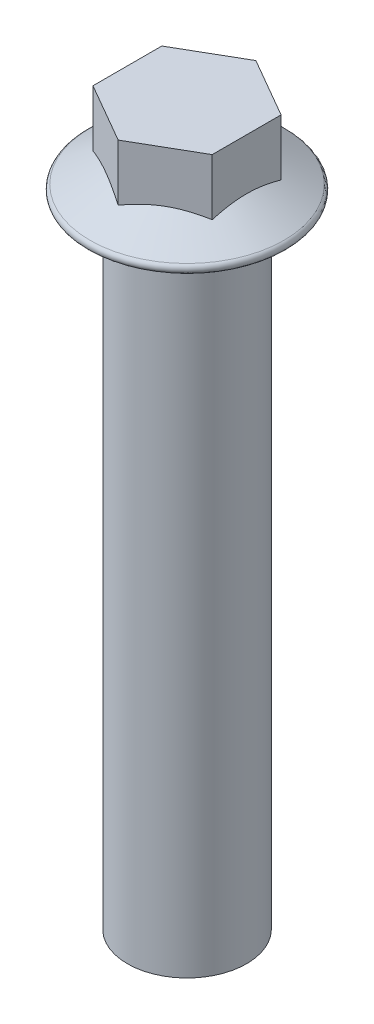
ISO-10303-21;
HEADER;
FILE_DESCRIPTION(('STEP AP214'),'2;1');
FILE_NAME('part.step','',(''),(''),'','','');
FILE_SCHEMA(('AUTOMOTIVE_DESIGN { 1 0 10303 214 1 1 1 1 }'));
ENDSEC;
DATA;
#1=APPLICATION_CONTEXT('core data for automotive mechanical design processes');
#2=APPLICATION_PROTOCOL_DEFINITION('international standard','automotive_design',2000,#1);
#3=PRODUCT_CONTEXT('',#1,'mechanical');
#4=PRODUCT('Part','Part','',(#3));
#5=PRODUCT_RELATED_PRODUCT_CATEGORY('part','',(#4));
#6=PRODUCT_DEFINITION_FORMATION('','',#4);
#7=PRODUCT_DEFINITION_CONTEXT('part definition',#1,'design');
#8=PRODUCT_DEFINITION('design','',#6,#7);
#9=PRODUCT_DEFINITION_SHAPE('','',#8);
#10=(LENGTH_UNIT() NAMED_UNIT(*) SI_UNIT(.MILLI.,.METRE.));
#11=(NAMED_UNIT(*) PLANE_ANGLE_UNIT() SI_UNIT($,.RADIAN.));
#12=(NAMED_UNIT(*) SI_UNIT($,.STERADIAN.) SOLID_ANGLE_UNIT());
#13=UNCERTAINTY_MEASURE_WITH_UNIT(LENGTH_MEASURE(1.E-05),#10,'distance_accuracy_value','');
#14=(GEOMETRIC_REPRESENTATION_CONTEXT(3) GLOBAL_UNCERTAINTY_ASSIGNED_CONTEXT((#13)) GLOBAL_UNIT_ASSIGNED_CONTEXT((#10,
#11,#12)) REPRESENTATION_CONTEXT('',''));
#15=CARTESIAN_POINT('',(0.,0.,0.));
#16=DIRECTION('',(0.,0.,1.));
#17=DIRECTION('',(1.,0.,0.));
#18=AXIS2_PLACEMENT_3D('',#15,#16,#17);
#19=CARTESIAN_POINT('',(0.,101.6,0.));
#20=DIRECTION('',(0.,-1.,0.));
#21=DIRECTION('',(0.,0.,-1.));
#22=AXIS2_PLACEMENT_3D('',#19,#20,#21);
#23=CYLINDRICAL_SURFACE('',#22,9.525);
#24=CARTESIAN_POINT('',(0.,101.6,0.));
#25=DIRECTION('',(0.,1.,0.));
#26=DIRECTION('',(0.,0.,1.));
#27=AXIS2_PLACEMENT_3D('',#24,#25,#26);
#28=CIRCLE('',#27,9.525);
#29=CARTESIAN_POINT('',(0.,101.6,9.525));
#30=VERTEX_POINT('',#29);
#31=EDGE_CURVE('E55',#30,#30,#28,.T.);
#32=ORIENTED_EDGE('',*,*,#31,.F.);
#33=EDGE_LOOP('',(#32));
#34=FACE_BOUND('',#33,.T.);
#35=CARTESIAN_POINT('',(0.,0.,0.));
#36=DIRECTION('',(0.,1.,0.));
#37=DIRECTION('',(0.,0.,1.));
#38=AXIS2_PLACEMENT_3D('',#35,#36,#37);
#39=CIRCLE('',#38,9.525);
#40=CARTESIAN_POINT('',(0.,0.,9.525));
#41=VERTEX_POINT('',#40);
#42=EDGE_CURVE('E196',#41,#41,#39,.T.);
#43=ORIENTED_EDGE('',*,*,#42,.T.);
#44=EDGE_LOOP('',(#43));
#45=FACE_BOUND('',#44,.T.);
#46=ADVANCED_FACE('F42',(#34,#45),#23,.T.);
#47=CARTESIAN_POINT('',(0.,0.,0.));
#48=DIRECTION('',(0.,1.,0.));
#49=DIRECTION('',(0.,0.,1.));
#50=AXIS2_PLACEMENT_3D('',#47,#48,#49);
#51=PLANE('',#50);
#52=CARTESIAN_POINT('',(0.,0.,0.));
#53=DIRECTION('',(0.,-1.,0.));
#54=DIRECTION('',(0.,0.,-1.));
#55=AXIS2_PLACEMENT_3D('',#52,#53,#54);
#56=CIRCLE('',#55,5.35812999999999);
#57=CARTESIAN_POINT('',(0.,0.,-5.35812999999999));
#58=VERTEX_POINT('',#57);
#59=EDGE_CURVE('E115',#58,#58,#56,.T.);
#60=ORIENTED_EDGE('',*,*,#59,.F.);
#61=EDGE_LOOP('',(#60));
#62=FACE_BOUND('',#61,.T.);
#63=ORIENTED_EDGE('',*,*,#42,.F.);
#64=EDGE_LOOP('',(#63));
#65=FACE_BOUND('',#64,.T.);
#66=ADVANCED_FACE('F182',(#62,#65),#51,.F.);
#67=CARTESIAN_POINT('',(0.,101.6,0.));
#68=DIRECTION('',(0.,-1.,0.));
#69=DIRECTION('',(0.,0.,-1.));
#70=AXIS2_PLACEMENT_3D('',#67,#68,#69);
#71=PLANE('',#70);
#72=ORIENTED_EDGE('',*,*,#31,.T.);
#73=EDGE_LOOP('',(#72));
#74=FACE_BOUND('',#73,.T.);
#75=CARTESIAN_POINT('',(0.,101.6,0.));
#76=DIRECTION('',(0.,-1.,0.));
#77=DIRECTION('',(1.,0.,0.));
#78=AXIS2_PLACEMENT_3D('',#75,#76,#77);
#79=CIRCLE('',#78,15.1082963753831);
#80=CARTESIAN_POINT('',(15.1082963753831,101.6,0.));
#81=VERTEX_POINT('',#80);
#82=EDGE_CURVE('E118',#81,#81,#79,.T.);
#83=ORIENTED_EDGE('',*,*,#82,.T.);
#84=EDGE_LOOP('',(#83));
#85=FACE_BOUND('',#84,.T.);
#86=ADVANCED_FACE('F147',(#74,#85),#71,.T.);
#87=CARTESIAN_POINT('',(0.,112.033072531662,0.));
#88=DIRECTION('',(0.,-1.,0.));
#89=DIRECTION('',(1.,0.,0.));
#90=AXIS2_PLACEMENT_3D('',#87,#88,#89);
#91=CONICAL_SURFACE('',#90,0.,1.0471975511966);
#92=CARTESIAN_POINT('',(0.,103.081157664254,0.));
#93=DIRECTION('',(0.,-1.,0.));
#94=DIRECTION('',(1.,0.,0.));
#95=AXIS2_PLACEMENT_3D('',#92,#93,#94);
#96=CIRCLE('',#95,15.5051713753831);
#97=CARTESIAN_POINT('',(15.5051713753831,103.081157664254,0.));
#98=VERTEX_POINT('',#97);
#99=EDGE_CURVE('E114',#98,#98,#96,.T.);
#100=ORIENTED_EDGE('',*,*,#99,.F.);
#101=EDGE_LOOP('',(#100));
#102=FACE_BOUND('',#101,.T.);
#103=CARTESIAN_POINT('',(-9.525,102.019915785762,-14.4935951045248));
#104=CARTESIAN_POINT('',(-9.525,102.119771856216,-14.2866287942035));
#105=CARTESIAN_POINT('',(-9.525,102.219108198637,-14.0794118473676));
#106=CARTESIAN_POINT('',(-9.525,102.416623063622,-13.6644242508099));
#107=CARTESIAN_POINT('',(-9.525,102.514801573584,-13.4566535950909));
#108=CARTESIAN_POINT('',(-9.525,102.807450620474,-12.832372924565));
#109=CARTESIAN_POINT('',(-9.525,103.000002802117,-12.4149600765863));
#110=CARTESIAN_POINT('',(-9.525,103.379868067489,-11.5748374861354));
#111=CARTESIAN_POINT('',(-9.525,103.567144365118,-11.152111068246));
#112=CARTESIAN_POINT('',(-9.525,103.933648504368,-10.3031954996916));
#113=CARTESIAN_POINT('',(-9.525,104.112876747702,-9.87700652311442));
#114=CARTESIAN_POINT('',(-9.525,104.466131529965,-9.0082204205499));
#115=CARTESIAN_POINT('',(-9.525,104.639862830153,-8.56550255921177));
#116=CARTESIAN_POINT('',(-9.525,104.97349080534,-7.67478808422141));
#117=CARTESIAN_POINT('',(-9.525,105.1333858919,-7.22679087117319));
#118=CARTESIAN_POINT('',(-9.525,105.434940409718,-6.325730472178));
#119=CARTESIAN_POINT('',(-9.525,105.57663922047,-5.87268061370604));
#120=CARTESIAN_POINT('',(-9.525,105.83707715476,-4.96011012380103));
#121=CARTESIAN_POINT('',(-9.525,105.955823802743,-4.50059166616066));
#122=CARTESIAN_POINT('',(-9.525,106.163902154091,-3.57705013004533));
#123=CARTESIAN_POINT('',(-9.525,106.253370812037,-3.11305878907075));
#124=CARTESIAN_POINT('',(-9.525,106.361567289479,-2.41307999933419));
#125=CARTESIAN_POINT('',(-9.525,106.39329983853,-2.17906985155997));
#126=CARTESIAN_POINT('',(-9.525,106.447468674522,-1.70998351601931));
#127=CARTESIAN_POINT('',(-9.525,106.46990584902,-1.47490743220029));
#128=CARTESIAN_POINT('',(-9.525,106.504769364559,-1.00695046448251));
#129=CARTESIAN_POINT('',(-9.525,106.517316700352,-0.774078624980496));
#130=CARTESIAN_POINT('',(-9.525,106.532576363659,-0.308013948404421));
#131=CARTESIAN_POINT('',(-9.525,106.535288846115,-0.074821116445283));
#132=CARTESIAN_POINT('',(-9.525,106.530814231536,0.39147717532233));
#133=CARTESIAN_POINT('',(-9.525,106.523626831945,0.624582632242708));
#134=CARTESIAN_POINT('',(-9.525,106.499521967316,1.09029330137625));
#135=CARTESIAN_POINT('',(-9.525,106.482603996255,1.32289848694218));
#136=CARTESIAN_POINT('',(-9.525,106.429810173597,1.89034327030716));
#137=CARTESIAN_POINT('',(-9.525,106.388852071915,2.22471764460386));
#138=CARTESIAN_POINT('',(-9.525,106.289126004335,2.89080207642086));
#139=CARTESIAN_POINT('',(-9.525,106.230355391462,3.22251173043302));
#140=CARTESIAN_POINT('',(-9.525,106.097095138146,3.88300360579086));
#141=CARTESIAN_POINT('',(-9.525,106.022592991278,4.21178327979651));
#142=CARTESIAN_POINT('',(-9.525,105.860121743613,4.86596003569804));
#143=CARTESIAN_POINT('',(-9.525,105.772152907011,5.1913571838202));
#144=CARTESIAN_POINT('',(-9.525,105.582680062788,5.84630145200541));
#145=CARTESIAN_POINT('',(-9.525,105.480910771813,6.17577130370605));
#146=CARTESIAN_POINT('',(-9.525,105.267444141501,6.83146143201844));
#147=CARTESIAN_POINT('',(-9.525,105.155746728328,7.15768168444233));
#148=CARTESIAN_POINT('',(-9.525,104.92414652241,7.80705083219056));
#149=CARTESIAN_POINT('',(-9.525,104.804246693786,8.13020078945637));
#150=CARTESIAN_POINT('',(-9.525,104.557594809195,8.77385581231393));
#151=CARTESIAN_POINT('',(-9.525,104.430842897697,9.09436093350572));
#152=CARTESIAN_POINT('',(-9.525,104.080660608296,9.95725080054012));
#153=CARTESIAN_POINT('',(-9.525,103.851828306228,10.4974417923221));
#154=CARTESIAN_POINT('',(-9.525,103.381955956943,11.572506333547));
#155=CARTESIAN_POINT('',(-9.525,103.140914707584,12.1073793531333));
#156=CARTESIAN_POINT('',(-9.525,102.649541489012,13.1730460909547));
#157=CARTESIAN_POINT('',(-9.525,102.399206417772,13.7038383744836));
#158=CARTESIAN_POINT('',(-9.525,101.89147779634,14.7620017747838));
#159=CARTESIAN_POINT('',(-9.525,101.634084503054,15.2893730152125));
#160=CARTESIAN_POINT('',(-9.525,101.113407918561,16.3421358228847));
#161=CARTESIAN_POINT('',(-9.525,100.850116711136,16.8675234673204));
#162=CARTESIAN_POINT('',(-9.525,100.319147326255,17.9160787346795));
#163=CARTESIAN_POINT('',(-9.525,100.051469115917,18.4392463409261));
#164=CARTESIAN_POINT('',(-9.525,99.5126402140084,19.4836592078866));
#165=CARTESIAN_POINT('',(-9.525,99.2414902091513,20.0049048232768));
#166=CARTESIAN_POINT('',(-9.525,98.6963154360731,21.0458912986243));
#167=CARTESIAN_POINT('',(-9.525,98.4222906579405,21.5656321533859));
#168=CARTESIAN_POINT('',(-9.525,97.6539500556607,23.0149547643607));
#169=CARTESIAN_POINT('',(-9.525,97.1570292024486,23.9431552396874));
#170=CARTESIAN_POINT('',(-9.525,96.1576888701562,25.7966506089527));
#171=CARTESIAN_POINT('',(-9.525,95.6552690917121,26.7219453411368));
#172=CARTESIAN_POINT('',(-9.525,94.6478166614444,28.5675656251149));
#173=CARTESIAN_POINT('',(-9.525,94.1427961034965,29.4878977824141));
#174=CARTESIAN_POINT('',(-9.525,93.3829354282915,30.86706955088));
#175=CARTESIAN_POINT('',(-9.525,93.1292689982839,31.3265566087974));
#176=CARTESIAN_POINT('',(-9.525,92.6212404741823,32.2451453677475));
#177=CARTESIAN_POINT('',(-9.525,92.3668783808376,32.7042470691947));
#178=CARTESIAN_POINT('',(-9.525,92.1122115077655,33.1631796847088));
#179=B_SPLINE_CURVE_WITH_KNOTS('',3,(#103,#104,#105,#106,#107,#108,#109,#110,#111,#112,#113,
#114,#115,#116,#117,#118,#119,#120,#121,#122,#123,#124,#125,#126,#127,#128,#129,#130,#131,#132,
#133,#134,#135,#136,#137,#138,#139,#140,#141,#142,#143,#144,#145,#146,#147,#148,#149,#150,#151,
#152,#153,#154,#155,#156,#157,#158,#159,#160,#161,#162,#163,#164,#165,#166,#167,#168,#169,#170,
#171,#172,#173,#174,#175,#176,#177,#178),.UNSPECIFIED.,.F.,.F.,(4,2,2,2,2,2,2,2,2,2,2,2,2,2,2,2,
2,2,2,2,2,2,2,2,2,2,2,2,2,2,2,2,2,2,2,2,2,4),(0.,0.689387227026352,1.37878195126197,
2.75779091431507,4.14478370852079,5.53170719495302,6.95828488683363,8.38502613760612,
9.80862571387312,11.2317577945604,12.6481343840629,13.35643426059,14.0646664904178,
14.7640933899208,15.4635092703791,16.1629465265214,16.8624201589925,17.8724764887064,
18.8826829884563,19.8936956372978,20.9046884541563,21.938988465498,22.9732961697387,
24.0072320588138,25.0411461567132,26.8008998808382,28.5608272156893,30.3213473434833,
32.0818034766396,33.8447838485144,35.6077774404,37.3704275437124,39.1330837261958,
42.2915953781862,45.4502798447675,48.5996384963749,50.1742094717577,51.7487787514473),.UNSPECIFIED.);
#180=CARTESIAN_POINT('',(-9.525,105.683072531663,5.49926131403119));
#181=VERTEX_POINT('',#180);
#182=CARTESIAN_POINT('',(-9.525,105.683072531663,-5.49926131403119));
#183=VERTEX_POINT('',#182);
#184=EDGE_CURVE('E69',#181,#183,#179,.F.);
#185=ORIENTED_EDGE('',*,*,#184,.T.);
#186=CARTESIAN_POINT('',(-9.5252,105.683005863946,-5.49914584397735));
#187=CARTESIAN_POINT('',(-9.31581967864219,105.752788016384,-5.62003162887629));
#188=CARTESIAN_POINT('',(-9.10565867807716,105.819402983673,-5.74136813912567));
#189=CARTESIAN_POINT('',(-8.68365134098093,105.945419747841,-5.98501418879818));
#190=CARTESIAN_POINT('',(-8.47180447441637,106.004819172322,-6.10732403423621));
#191=CARTESIAN_POINT('',(-7.83285037479193,106.171044612924,-6.47622435565419));
#192=CARTESIAN_POINT('',(-7.40322078278332,106.265592887713,-6.72427111625219));
#193=CARTESIAN_POINT('',(-6.76029976573862,106.376459588786,-7.09546173851062));
#194=CARTESIAN_POINT('',(-6.54892911393193,106.408041351482,-7.21749664123));
#195=CARTESIAN_POINT('',(-6.12520917517603,106.461001964502,-7.46213146193172));
#196=CARTESIAN_POINT('',(-5.91285986947048,106.48238061845,-7.58473139074305));
#197=CARTESIAN_POINT('',(-5.48780704353704,106.514387240959,-7.83013575421554));
#198=CARTESIAN_POINT('',(-5.27510424653561,106.525027985046,-7.9529397713217));
#199=CARTESIAN_POINT('',(-4.84950217933072,106.53533268268,-8.19866123939011));
#200=CARTESIAN_POINT('',(-4.63660291540071,106.534996975367,-8.32157868673037));
#201=CARTESIAN_POINT('',(-4.23858252685178,106.5241123774,-8.55137586520205));
#202=CARTESIAN_POINT('',(-4.0534333100133,106.514891273124,-8.658271815384));
#203=CARTESIAN_POINT('',(-3.68356790086971,106.48832641662,-8.87181370891698));
#204=CARTESIAN_POINT('',(-3.49885174012527,106.470982089806,-8.97845963404645));
#205=CARTESIAN_POINT('',(-2.94541899032713,106.407174339606,-9.29798418112076));
#206=CARTESIAN_POINT('',(-2.57768201658395,106.34894409616,-9.51029722190237));
#207=CARTESIAN_POINT('',(-1.83830726497711,106.203367925661,-9.93717543377459));
#208=CARTESIAN_POINT('',(-1.46676384734824,106.115404921285,-10.1516861259583));
#209=CARTESIAN_POINT('',(-0.729217612400581,105.915765420275,-10.5775086432451));
#210=CARTESIAN_POINT('',(-0.363205350578883,105.804135812171,-10.7888259211345));
#211=CARTESIAN_POINT('',(0.000200000000001881,105.683005863946,-10.9986380981162));
#212=B_SPLINE_CURVE_WITH_KNOTS('',3,(#186,#187,#188,#189,#190,#191,#192,#193,#194,#195,#196,
#197,#198,#199,#200,#201,#202,#203,#204,#205,#206,#207,#208,#209,#210,#211),.UNSPECIFIED.,.F.,
.F.,(4,2,2,2,2,2,2,2,2,2,2,2,4),(0.,0.754861746958001,1.50997101692212,3.02340406075151,
3.76154608748042,4.49970232035707,5.23697928598072,5.97423347202913,6.61604550518408,
7.25790294292824,8.54252993638602,9.85564695316764,11.1661863217647),.UNSPECIFIED.);
#213=CARTESIAN_POINT('',(0.,105.683072531663,-10.9985226280624));
#214=VERTEX_POINT('',#213);
#215=EDGE_CURVE('E62',#183,#214,#212,.T.);
#216=ORIENTED_EDGE('',*,*,#215,.T.);
#217=CARTESIAN_POINT('',(-0.000199999999998449,105.683005863946,-10.9986380981162));
#218=CARTESIAN_POINT('',(0.209180321357819,105.752788016384,-10.8777523132173));
#219=CARTESIAN_POINT('',(0.419341321922849,105.819402983673,-10.7564158029679));
#220=CARTESIAN_POINT('',(0.841348659019078,105.945419747841,-10.5127697532954));
#221=CARTESIAN_POINT('',(1.05319552558363,106.004819172322,-10.3904599078573));
#222=CARTESIAN_POINT('',(1.69214962520808,106.171044612924,-10.0215595864394));
#223=CARTESIAN_POINT('',(2.12177921721668,106.265592887713,-9.77351282584137));
#224=CARTESIAN_POINT('',(2.76470023426138,106.376459588786,-9.40232220358294));
#225=CARTESIAN_POINT('',(2.97607088606807,106.408041351482,-9.28028730086356));
#226=CARTESIAN_POINT('',(3.39979082482397,106.461001964502,-9.03565248016183));
#227=CARTESIAN_POINT('',(3.61214013052952,106.48238061845,-8.91305255135051));
#228=CARTESIAN_POINT('',(4.03719295646296,106.514387240959,-8.66764818787802));
#229=CARTESIAN_POINT('',(4.24989575346439,106.525027985046,-8.54484417077186));
#230=CARTESIAN_POINT('',(4.67549782066928,106.53533268268,-8.29912270270345));
#231=CARTESIAN_POINT('',(4.88839708459929,106.534996975367,-8.17620525536319));
#232=CARTESIAN_POINT('',(5.28641747314821,106.5241123774,-7.94640807689151));
#233=CARTESIAN_POINT('',(5.4715666899867,106.514891273124,-7.83951212670956));
#234=CARTESIAN_POINT('',(5.84143209913029,106.48832641662,-7.62597023317658));
#235=CARTESIAN_POINT('',(6.02614825987472,106.470982089806,-7.51932430804711));
#236=CARTESIAN_POINT('',(6.57958100967286,106.407174339606,-7.19979976097279));
#237=CARTESIAN_POINT('',(6.94731798341604,106.34894409616,-6.98748672019119));
#238=CARTESIAN_POINT('',(7.68669273502289,106.203367925661,-6.56060850831896));
#239=CARTESIAN_POINT('',(8.05823615265176,106.115404921285,-6.3460978161353));
#240=CARTESIAN_POINT('',(8.79578238759942,105.915765420275,-5.92027529884848));
#241=CARTESIAN_POINT('',(9.16179464942112,105.804135812171,-5.70895802095902));
#242=CARTESIAN_POINT('',(9.5252,105.683005863946,-5.49914584397735));
#243=B_SPLINE_CURVE_WITH_KNOTS('',3,(#217,#218,#219,#220,#221,#222,#223,#224,#225,#226,#227,
#228,#229,#230,#231,#232,#233,#234,#235,#236,#237,#238,#239,#240,#241,#242),.UNSPECIFIED.,.F.,
.F.,(4,2,2,2,2,2,2,2,2,2,2,2,4),(0.,0.754861746958,1.50997101692211,3.0234040607515,
3.76154608748042,4.49970232035706,5.23697928598071,5.97423347202912,6.61604550518407,
7.25790294292822,8.54252993638601,9.85564695316763,11.1661863217647),.UNSPECIFIED.);
#244=CARTESIAN_POINT('',(9.525,105.683072531663,-5.49926131403119));
#245=VERTEX_POINT('',#244);
#246=EDGE_CURVE('E11',#214,#245,#243,.T.);
#247=ORIENTED_EDGE('',*,*,#246,.T.);
#248=CARTESIAN_POINT('',(9.525,102.019915785762,-14.4935951045248));
#249=CARTESIAN_POINT('',(9.525,102.119771856216,-14.2866287942035));
#250=CARTESIAN_POINT('',(9.525,102.219108198637,-14.0794118473676));
#251=CARTESIAN_POINT('',(9.525,102.416623063622,-13.6644242508099));
#252=CARTESIAN_POINT('',(9.525,102.514801573584,-13.4566535950909));
#253=CARTESIAN_POINT('',(9.525,102.807450620474,-12.832372924565));
#254=CARTESIAN_POINT('',(9.525,103.000002802117,-12.4149600765863));
#255=CARTESIAN_POINT('',(9.525,103.379868067489,-11.5748374861354));
#256=CARTESIAN_POINT('',(9.525,103.567144365118,-11.152111068246));
#257=CARTESIAN_POINT('',(9.525,103.933648504368,-10.3031954996916));
#258=CARTESIAN_POINT('',(9.525,104.112876747702,-9.87700652311441));
#259=CARTESIAN_POINT('',(9.525,104.466131529965,-9.0082204205499));
#260=CARTESIAN_POINT('',(9.525,104.639862830153,-8.56550255921177));
#261=CARTESIAN_POINT('',(9.525,104.97349080534,-7.6747880842214));
#262=CARTESIAN_POINT('',(9.525,105.1333858919,-7.22679087117319));
#263=CARTESIAN_POINT('',(9.525,105.434940409718,-6.325730472178));
#264=CARTESIAN_POINT('',(9.525,105.57663922047,-5.87268061370604));
#265=CARTESIAN_POINT('',(9.525,105.83707715476,-4.96011012380103));
#266=CARTESIAN_POINT('',(9.525,105.955823802743,-4.50059166616066));
#267=CARTESIAN_POINT('',(9.525,106.163902154091,-3.57705013004532));
#268=CARTESIAN_POINT('',(9.525,106.253370812037,-3.11305878907074));
#269=CARTESIAN_POINT('',(9.525,106.361567289479,-2.41307999933419));
#270=CARTESIAN_POINT('',(9.525,106.39329983853,-2.17906985155997));
#271=CARTESIAN_POINT('',(9.525,106.447468674522,-1.70998351601931));
#272=CARTESIAN_POINT('',(9.525,106.46990584902,-1.47490743220029));
#273=CARTESIAN_POINT('',(9.525,106.504769364559,-1.00695046448251));
#274=CARTESIAN_POINT('',(9.525,106.517316700352,-0.774078624980493));
#275=CARTESIAN_POINT('',(9.525,106.532576363659,-0.308013948404418));
#276=CARTESIAN_POINT('',(9.525,106.535288846115,-0.0748211164452796));
#277=CARTESIAN_POINT('',(9.525,106.530814231536,0.391477175322334));
#278=CARTESIAN_POINT('',(9.525,106.523626831945,0.624582632242711));
#279=CARTESIAN_POINT('',(9.525,106.499521967316,1.09029330137625));
#280=CARTESIAN_POINT('',(9.525,106.482603996255,1.32289848694219));
#281=CARTESIAN_POINT('',(9.525,106.429810173597,1.89034327030716));
#282=CARTESIAN_POINT('',(9.525,106.388852071915,2.22471764460386));
#283=CARTESIAN_POINT('',(9.525,106.289126004335,2.89080207642086));
#284=CARTESIAN_POINT('',(9.525,106.230355391462,3.22251173043302));
#285=CARTESIAN_POINT('',(9.525,106.097095138146,3.88300360579086));
#286=CARTESIAN_POINT('',(9.525,106.022592991278,4.21178327979651));
#287=CARTESIAN_POINT('',(9.525,105.860121743613,4.86596003569804));
#288=CARTESIAN_POINT('',(9.525,105.772152907011,5.19135718382019));
#289=CARTESIAN_POINT('',(9.525,105.582680062788,5.84630145200541));
#290=CARTESIAN_POINT('',(9.525,105.480910771813,6.17577130370606));
#291=CARTESIAN_POINT('',(9.525,105.267444141501,6.83146143201845));
#292=CARTESIAN_POINT('',(9.525,105.155746728328,7.15768168444233));
#293=CARTESIAN_POINT('',(9.525,104.92414652241,7.80705083219055));
#294=CARTESIAN_POINT('',(9.525,104.804246693786,8.13020078945637));
#295=CARTESIAN_POINT('',(9.525,104.557594809195,8.77385581231392));
#296=CARTESIAN_POINT('',(9.525,104.430842897697,9.09436093350572));
#297=CARTESIAN_POINT('',(9.525,104.080660608296,9.95725080054012));
#298=CARTESIAN_POINT('',(9.525,103.851828306228,10.4974417923221));
#299=CARTESIAN_POINT('',(9.525,103.381955956943,11.572506333547));
#300=CARTESIAN_POINT('',(9.525,103.140914707584,12.1073793531333));
#301=CARTESIAN_POINT('',(9.525,102.649541489012,13.1730460909547));
#302=CARTESIAN_POINT('',(9.525,102.399206417772,13.7038383744836));
#303=CARTESIAN_POINT('',(9.525,101.89147779634,14.7620017747838));
#304=CARTESIAN_POINT('',(9.525,101.634084503054,15.2893730152125));
#305=CARTESIAN_POINT('',(9.525,101.113407918561,16.3421358228847));
#306=CARTESIAN_POINT('',(9.525,100.850116711136,16.8675234673204));
#307=CARTESIAN_POINT('',(9.525,100.319147326255,17.9160787346795));
#308=CARTESIAN_POINT('',(9.525,100.051469115917,18.4392463409261));
#309=CARTESIAN_POINT('',(9.525,99.5126402140084,19.4836592078866));
#310=CARTESIAN_POINT('',(9.525,99.2414902091513,20.0049048232767));
#311=CARTESIAN_POINT('',(9.525,98.6963154360731,21.0458912986243));
#312=CARTESIAN_POINT('',(9.525,98.4222906579405,21.5656321533859));
#313=CARTESIAN_POINT('',(9.525,97.6539500556607,23.0149547643607));
#314=CARTESIAN_POINT('',(9.525,97.1570292024486,23.9431552396874));
#315=CARTESIAN_POINT('',(9.525,96.1576888701562,25.7966506089527));
#316=CARTESIAN_POINT('',(9.525,95.6552690917121,26.7219453411368));
#317=CARTESIAN_POINT('',(9.525,94.6478166614444,28.5675656251149));
#318=CARTESIAN_POINT('',(9.525,94.1427961034965,29.4878977824141));
#319=CARTESIAN_POINT('',(9.525,93.3829354282915,30.8670695508799));
#320=CARTESIAN_POINT('',(9.525,93.129268998284,31.3265566087973));
#321=CARTESIAN_POINT('',(9.525,92.6212404741823,32.2451453677475));
#322=CARTESIAN_POINT('',(9.525,92.3668783808376,32.7042470691946));
#323=CARTESIAN_POINT('',(9.525,92.1122115077655,33.1631796847088));
#324=B_SPLINE_CURVE_WITH_KNOTS('',3,(#248,#249,#250,#251,#252,#253,#254,#255,#256,#257,#258,
#259,#260,#261,#262,#263,#264,#265,#266,#267,#268,#269,#270,#271,#272,#273,#274,#275,#276,#277,
#278,#279,#280,#281,#282,#283,#284,#285,#286,#287,#288,#289,#290,#291,#292,#293,#294,#295,#296,
#297,#298,#299,#300,#301,#302,#303,#304,#305,#306,#307,#308,#309,#310,#311,#312,#313,#314,#315,
#316,#317,#318,#319,#320,#321,#322,#323),.UNSPECIFIED.,.F.,.F.,(4,2,2,2,2,2,2,2,2,2,2,2,2,2,2,2,
2,2,2,2,2,2,2,2,2,2,2,2,2,2,2,2,2,2,2,2,2,4),(0.,0.689387227026353,1.37878195126197,
2.75779091431507,4.14478370852079,5.53170719495302,6.95828488683363,8.38502613760612,
9.80862571387312,11.2317577945604,12.6481343840629,13.35643426059,14.0646664904178,
14.7640933899208,15.4635092703791,16.1629465265214,16.8624201589925,17.8724764887064,
18.8826829884563,19.8936956372978,20.9046884541563,21.938988465498,22.9732961697387,
24.0072320588138,25.0411461567132,26.8008998808382,28.5608272156893,30.3213473434833,
32.0818034766396,33.8447838485144,35.6077774404,37.3704275437124,39.1330837261958,
42.2915953781862,45.4502798447675,48.5996384963749,50.1742094717577,51.7487787514473),.UNSPECIFIED.);
#325=CARTESIAN_POINT('',(9.525,105.683072531663,5.49926131403119));
#326=VERTEX_POINT('',#325);
#327=EDGE_CURVE('E125',#245,#326,#324,.T.);
#328=ORIENTED_EDGE('',*,*,#327,.T.);
#329=CARTESIAN_POINT('',(9.5252,105.683005863946,5.49914584397735));
#330=CARTESIAN_POINT('',(9.31581967864219,105.752788016384,5.62003162887629));
#331=CARTESIAN_POINT('',(9.10565867807716,105.819402983673,5.74136813912567));
#332=CARTESIAN_POINT('',(8.68365134098093,105.945419747841,5.98501418879818));
#333=CARTESIAN_POINT('',(8.47180447441637,106.004819172322,6.1073240342362));
#334=CARTESIAN_POINT('',(7.83285037479193,106.171044612924,6.47622435565419));
#335=CARTESIAN_POINT('',(7.40322078278332,106.265592887713,6.72427111625219));
#336=CARTESIAN_POINT('',(6.76029976573862,106.376459588786,7.09546173851062));
#337=CARTESIAN_POINT('',(6.54892911393193,106.408041351482,7.21749664122999));
#338=CARTESIAN_POINT('',(6.12520917517603,106.461001964502,7.46213146193172));
#339=CARTESIAN_POINT('',(5.91285986947049,106.48238061845,7.58473139074305));
#340=CARTESIAN_POINT('',(5.48780704353704,106.514387240959,7.83013575421554));
#341=CARTESIAN_POINT('',(5.27510424653561,106.525027985046,7.9529397713217));
#342=CARTESIAN_POINT('',(4.84950217933072,106.53533268268,8.1986612393901));
#343=CARTESIAN_POINT('',(4.63660291540071,106.534996975367,8.32157868673037));
#344=CARTESIAN_POINT('',(4.23858252685178,106.5241123774,8.55137586520205));
#345=CARTESIAN_POINT('',(4.0534333100133,106.514891273124,8.65827181538399));
#346=CARTESIAN_POINT('',(3.68356790086971,106.48832641662,8.87181370891698));
#347=CARTESIAN_POINT('',(3.49885174012528,106.470982089806,8.97845963404645));
#348=CARTESIAN_POINT('',(2.94541899032714,106.407174339606,9.29798418112076));
#349=CARTESIAN_POINT('',(2.57768201658395,106.34894409616,9.51029722190237));
#350=CARTESIAN_POINT('',(1.83830726497711,106.203367925661,9.93717543377459));
#351=CARTESIAN_POINT('',(1.46676384734825,106.115404921285,10.1516861259582));
#352=CARTESIAN_POINT('',(0.729217612400588,105.915765420275,10.5775086432451));
#353=CARTESIAN_POINT('',(0.363205350578887,105.804135812171,10.7888259211345));
#354=CARTESIAN_POINT('',(-0.000199999999999305,105.683005863946,10.9986380981162));
#355=B_SPLINE_CURVE_WITH_KNOTS('',3,(#329,#330,#331,#332,#333,#334,#335,#336,#337,#338,#339,
#340,#341,#342,#343,#344,#345,#346,#347,#348,#349,#350,#351,#352,#353,#354),.UNSPECIFIED.,.F.,
.F.,(4,2,2,2,2,2,2,2,2,2,2,2,4),(0.,0.754861746958003,1.50997101692212,3.02340406075151,
3.76154608748042,4.49970232035707,5.23697928598072,5.97423347202913,6.61604550518408,
7.25790294292823,8.54252993638601,9.85564695316763,11.1661863217647),.UNSPECIFIED.);
#356=CARTESIAN_POINT('',(0.,105.683072531663,10.9985226280624));
#357=VERTEX_POINT('',#356);
#358=EDGE_CURVE('E133',#326,#357,#355,.T.);
#359=ORIENTED_EDGE('',*,*,#358,.T.);
#360=CARTESIAN_POINT('',(0.000199999999998449,105.683005863946,10.9986380981162));
#361=CARTESIAN_POINT('',(-0.209180321357819,105.752788016384,10.8777523132173));
#362=CARTESIAN_POINT('',(-0.41934132192285,105.819402983673,10.7564158029679));
#363=CARTESIAN_POINT('',(-0.84134865901908,105.945419747841,10.5127697532954));
#364=CARTESIAN_POINT('',(-1.05319552558364,106.004819172322,10.3904599078574));
#365=CARTESIAN_POINT('',(-1.69214962520808,106.171044612924,10.0215595864394));
#366=CARTESIAN_POINT('',(-2.12177921721668,106.265592887713,9.77351282584137));
#367=CARTESIAN_POINT('',(-2.76470023426138,106.376459588786,9.40232220358294));
#368=CARTESIAN_POINT('',(-2.97607088606807,106.408041351482,9.28028730086356));
#369=CARTESIAN_POINT('',(-3.39979082482397,106.461001964502,9.03565248016183));
#370=CARTESIAN_POINT('',(-3.61214013052952,106.48238061845,8.91305255135051));
#371=CARTESIAN_POINT('',(-4.03719295646296,106.514387240959,8.66764818787802));
#372=CARTESIAN_POINT('',(-4.24989575346438,106.525027985046,8.54484417077186));
#373=CARTESIAN_POINT('',(-4.67549782066928,106.53533268268,8.29912270270346));
#374=CARTESIAN_POINT('',(-4.88839708459929,106.534996975367,8.17620525536319));
#375=CARTESIAN_POINT('',(-5.28641747314821,106.5241123774,7.94640807689151));
#376=CARTESIAN_POINT('',(-5.47156668998669,106.514891273124,7.83951212670956));
#377=CARTESIAN_POINT('',(-5.84143209913028,106.48832641662,7.62597023317658));
#378=CARTESIAN_POINT('',(-6.02614825987472,106.470982089806,7.51932430804711));
#379=CARTESIAN_POINT('',(-6.57958100967286,106.407174339606,7.1997997609728));
#380=CARTESIAN_POINT('',(-6.94731798341605,106.34894409616,6.98748672019119));
#381=CARTESIAN_POINT('',(-7.68669273502289,106.203367925661,6.56060850831897));
#382=CARTESIAN_POINT('',(-8.05823615265176,106.115404921285,6.34609781613531));
#383=CARTESIAN_POINT('',(-8.79578238759941,105.915765420275,5.92027529884848));
#384=CARTESIAN_POINT('',(-9.16179464942111,105.804135812171,5.70895802095902));
#385=CARTESIAN_POINT('',(-9.5252,105.683005863946,5.49914584397735));
#386=B_SPLINE_CURVE_WITH_KNOTS('',3,(#360,#361,#362,#363,#364,#365,#366,#367,#368,#369,#370,
#371,#372,#373,#374,#375,#376,#377,#378,#379,#380,#381,#382,#383,#384,#385),.UNSPECIFIED.,.F.,
.F.,(4,2,2,2,2,2,2,2,2,2,2,2,4),(0.,0.754861746958001,1.50997101692211,3.0234040607515,
3.76154608748042,4.49970232035706,5.23697928598071,5.97423347202912,6.61604550518406,
7.25790294292822,8.542529936386,9.85564695316763,11.1661863217647),.UNSPECIFIED.);
#387=EDGE_CURVE('E157',#357,#181,#386,.T.);
#388=ORIENTED_EDGE('',*,*,#387,.T.);
#389=EDGE_LOOP('',(#185,#216,#247,#328,#359,#388));
#390=FACE_BOUND('',#389,.T.);
#391=ADVANCED_FACE('F142',(#102,#390),#91,.T.);
#392=CARTESIAN_POINT('',(0.,102.39375,0.));
#393=DIRECTION('',(0.,-1.,0.));
#394=DIRECTION('',(1.,0.,0.));
#395=AXIS2_PLACEMENT_3D('',#392,#393,#394);
#396=TOROIDAL_SURFACE('',#395,15.1082963753831,0.793749999999977);
#397=ORIENTED_EDGE('',*,*,#82,.F.);
#398=EDGE_LOOP('',(#397));
#399=FACE_BOUND('',#398,.T.);
#400=ORIENTED_EDGE('',*,*,#99,.T.);
#401=EDGE_LOOP('',(#400));
#402=FACE_BOUND('',#401,.T.);
#403=ADVANCED_FACE('F146',(#399,#402),#396,.T.);
#404=CARTESIAN_POINT('',(0.,114.696875,0.));
#405=DIRECTION('',(0.,-1.,0.));
#406=DIRECTION('',(0.,0.,-1.));
#407=AXIS2_PLACEMENT_3D('',#404,#405,#406);
#408=PLANE('',#407);
#409=DIRECTION('',(-0.866025403784439,0.,0.5));
#410=VECTOR('',#409,1.);
#411=CARTESIAN_POINT('',(-9.525,114.696875,-5.49926131403119));
#412=LINE('',#411,#410);
#413=CARTESIAN_POINT('',(0.,114.696875,-10.9985226280624));
#414=VERTEX_POINT('',#413);
#415=CARTESIAN_POINT('',(-9.525,114.696875,-5.49926131403119));
#416=VERTEX_POINT('',#415);
#417=EDGE_CURVE('E224',#414,#416,#412,.T.);
#418=ORIENTED_EDGE('',*,*,#417,.T.);
#419=DIRECTION('',(0.,0.,1.));
#420=VECTOR('',#419,1.);
#421=CARTESIAN_POINT('',(-9.525,114.696875,5.49926131403119));
#422=LINE('',#421,#420);
#423=CARTESIAN_POINT('',(-9.525,114.696875,5.49926131403119));
#424=VERTEX_POINT('',#423);
#425=EDGE_CURVE('E223',#416,#424,#422,.T.);
#426=ORIENTED_EDGE('',*,*,#425,.T.);
#427=DIRECTION('',(0.866025403784439,0.,0.5));
#428=VECTOR('',#427,1.);
#429=CARTESIAN_POINT('',(0.,114.696875,10.9985226280624));
#430=LINE('',#429,#428);
#431=CARTESIAN_POINT('',(0.,114.696875,10.9985226280624));
#432=VERTEX_POINT('',#431);
#433=EDGE_CURVE('E221',#424,#432,#430,.T.);
#434=ORIENTED_EDGE('',*,*,#433,.T.);
#435=DIRECTION('',(0.866025403784439,0.,-0.5));
#436=VECTOR('',#435,1.);
#437=CARTESIAN_POINT('',(9.525,114.696875,5.49926131403119));
#438=LINE('',#437,#436);
#439=CARTESIAN_POINT('',(9.525,114.696875,5.49926131403119));
#440=VERTEX_POINT('',#439);
#441=EDGE_CURVE('E219',#432,#440,#438,.T.);
#442=ORIENTED_EDGE('',*,*,#441,.T.);
#443=DIRECTION('',(0.,0.,-1.));
#444=VECTOR('',#443,1.);
#445=CARTESIAN_POINT('',(9.525,114.696875,-5.49926131403119));
#446=LINE('',#445,#444);
#447=CARTESIAN_POINT('',(9.525,114.696875,-5.49926131403119));
#448=VERTEX_POINT('',#447);
#449=EDGE_CURVE('E217',#440,#448,#446,.T.);
#450=ORIENTED_EDGE('',*,*,#449,.T.);
#451=DIRECTION('',(-0.866025403784439,0.,-0.5));
#452=VECTOR('',#451,1.);
#453=CARTESIAN_POINT('',(0.,114.696875,-10.9985226280624));
#454=LINE('',#453,#452);
#455=EDGE_CURVE('E215',#448,#414,#454,.T.);
#456=ORIENTED_EDGE('',*,*,#455,.T.);
#457=EDGE_LOOP('',(#418,#426,#434,#442,#450,#456));
#458=FACE_BOUND('',#457,.T.);
#459=ADVANCED_FACE('F239',(#458),#408,.F.);
#460=CARTESIAN_POINT('',(0.,114.696875,-10.9985226280624));
#461=DIRECTION('',(-0.5,0.,0.866025403784439));
#462=DIRECTION('',(0.866025403784439,0.,0.5));
#463=AXIS2_PLACEMENT_3D('',#460,#461,#462);
#464=PLANE('',#463);
#465=ORIENTED_EDGE('',*,*,#246,.F.);
#466=DIRECTION('',(0.,-1.,0.));
#467=VECTOR('',#466,1.);
#468=CARTESIAN_POINT('',(0.,114.696875,-10.9985226280624));
#469=LINE('',#468,#467);
#470=EDGE_CURVE('E213',#414,#214,#469,.T.);
#471=ORIENTED_EDGE('',*,*,#470,.F.);
#472=ORIENTED_EDGE('',*,*,#455,.F.);
#473=DIRECTION('',(0.,-1.,0.));
#474=VECTOR('',#473,1.);
#475=CARTESIAN_POINT('',(9.525,114.696875,-5.49926131403119));
#476=LINE('',#475,#474);
#477=EDGE_CURVE('E211',#448,#245,#476,.T.);
#478=ORIENTED_EDGE('',*,*,#477,.T.);
#479=EDGE_LOOP('',(#465,#471,#472,#478));
#480=FACE_BOUND('',#479,.T.);
#481=ADVANCED_FACE('F244',(#480),#464,.F.);
#482=CARTESIAN_POINT('',(9.525,114.696875,-5.49926131403119));
#483=DIRECTION('',(-1.,0.,0.));
#484=DIRECTION('',(0.,0.,1.));
#485=AXIS2_PLACEMENT_3D('',#482,#483,#484);
#486=PLANE('',#485);
#487=ORIENTED_EDGE('',*,*,#327,.F.);
#488=ORIENTED_EDGE('',*,*,#477,.F.);
#489=ORIENTED_EDGE('',*,*,#449,.F.);
#490=DIRECTION('',(0.,-1.,0.));
#491=VECTOR('',#490,1.);
#492=CARTESIAN_POINT('',(9.525,114.696875,5.49926131403119));
#493=LINE('',#492,#491);
#494=EDGE_CURVE('E208',#440,#326,#493,.T.);
#495=ORIENTED_EDGE('',*,*,#494,.T.);
#496=EDGE_LOOP('',(#487,#488,#489,#495));
#497=FACE_BOUND('',#496,.T.);
#498=ADVANCED_FACE('F140',(#497),#486,.F.);
#499=CARTESIAN_POINT('',(9.525,114.696875,5.49926131403119));
#500=DIRECTION('',(-0.5,0.,-0.866025403784439));
#501=DIRECTION('',(-0.866025403784439,0.,0.5));
#502=AXIS2_PLACEMENT_3D('',#499,#500,#501);
#503=PLANE('',#502);
#504=ORIENTED_EDGE('',*,*,#358,.F.);
#505=ORIENTED_EDGE('',*,*,#494,.F.);
#506=ORIENTED_EDGE('',*,*,#441,.F.);
#507=DIRECTION('',(0.,-1.,0.));
#508=VECTOR('',#507,1.);
#509=CARTESIAN_POINT('',(0.,114.696875,10.9985226280624));
#510=LINE('',#509,#508);
#511=EDGE_CURVE('E205',#432,#357,#510,.T.);
#512=ORIENTED_EDGE('',*,*,#511,.T.);
#513=EDGE_LOOP('',(#504,#505,#506,#512));
#514=FACE_BOUND('',#513,.T.);
#515=ADVANCED_FACE('F236',(#514),#503,.F.);
#516=CARTESIAN_POINT('',(0.,114.696875,10.9985226280624));
#517=DIRECTION('',(0.5,0.,-0.866025403784439));
#518=DIRECTION('',(-0.866025403784439,0.,-0.5));
#519=AXIS2_PLACEMENT_3D('',#516,#517,#518);
#520=PLANE('',#519);
#521=ORIENTED_EDGE('',*,*,#387,.F.);
#522=ORIENTED_EDGE('',*,*,#511,.F.);
#523=ORIENTED_EDGE('',*,*,#433,.F.);
#524=DIRECTION('',(0.,-1.,0.));
#525=VECTOR('',#524,1.);
#526=CARTESIAN_POINT('',(-9.525,114.696875,5.49926131403119));
#527=LINE('',#526,#525);
#528=EDGE_CURVE('E201',#424,#181,#527,.T.);
#529=ORIENTED_EDGE('',*,*,#528,.T.);
#530=EDGE_LOOP('',(#521,#522,#523,#529));
#531=FACE_BOUND('',#530,.T.);
#532=ADVANCED_FACE('F178',(#531),#520,.F.);
#533=CARTESIAN_POINT('',(-9.525,114.696875,5.49926131403119));
#534=DIRECTION('',(1.,0.,0.));
#535=DIRECTION('',(0.,0.,-1.));
#536=AXIS2_PLACEMENT_3D('',#533,#534,#535);
#537=PLANE('',#536);
#538=ORIENTED_EDGE('',*,*,#184,.F.);
#539=ORIENTED_EDGE('',*,*,#528,.F.);
#540=ORIENTED_EDGE('',*,*,#425,.F.);
#541=DIRECTION('',(0.,-1.,0.));
#542=VECTOR('',#541,1.);
#543=CARTESIAN_POINT('',(-9.525,114.696875,-5.49926131403119));
#544=LINE('',#543,#542);
#545=EDGE_CURVE('E198',#416,#183,#544,.T.);
#546=ORIENTED_EDGE('',*,*,#545,.T.);
#547=EDGE_LOOP('',(#538,#539,#540,#546));
#548=FACE_BOUND('',#547,.T.);
#549=ADVANCED_FACE('F175',(#548),#537,.F.);
#550=CARTESIAN_POINT('',(-9.525,114.696875,-5.49926131403119));
#551=DIRECTION('',(0.5,0.,0.866025403784439));
#552=DIRECTION('',(0.866025403784439,0.,-0.5));
#553=AXIS2_PLACEMENT_3D('',#550,#551,#552);
#554=PLANE('',#553);
#555=ORIENTED_EDGE('',*,*,#215,.F.);
#556=ORIENTED_EDGE('',*,*,#545,.F.);
#557=ORIENTED_EDGE('',*,*,#417,.F.);
#558=ORIENTED_EDGE('',*,*,#470,.T.);
#559=EDGE_LOOP('',(#555,#556,#557,#558));
#560=FACE_BOUND('',#559,.T.);
#561=ADVANCED_FACE('F108',(#560),#554,.F.);
#562=CARTESIAN_POINT('',(0.,25.4,0.));
#563=DIRECTION('',(0.,-1.,0.));
#564=DIRECTION('',(0.,0.,-1.));
#565=AXIS2_PLACEMENT_3D('',#562,#563,#564);
#566=CONICAL_SURFACE('',#565,5.35812999999999,1.02974425867665);
#567=CARTESIAN_POINT('',(0.,28.6194893086301,0.));
#568=VERTEX_POINT('',#567);
#569=VERTEX_LOOP('',#568);
#570=FACE_BOUND('',#569,.T.);
#571=CARTESIAN_POINT('',(0.,25.4,0.));
#572=DIRECTION('',(0.,-1.,0.));
#573=DIRECTION('',(0.,0.,-1.));
#574=AXIS2_PLACEMENT_3D('',#571,#572,#573);
#575=CIRCLE('',#574,5.35812999999999);
#576=CARTESIAN_POINT('',(0.,25.4,-5.35812999999999));
#577=VERTEX_POINT('',#576);
#578=EDGE_CURVE('E112',#577,#577,#575,.T.);
#579=ORIENTED_EDGE('',*,*,#578,.T.);
#580=EDGE_LOOP('',(#579));
#581=FACE_BOUND('',#580,.T.);
#582=ADVANCED_FACE('F104',(#570,#581),#566,.F.);
#583=CARTESIAN_POINT('',(0.,0.,0.));
#584=DIRECTION('',(0.,-1.,0.));
#585=DIRECTION('',(0.,0.,-1.));
#586=AXIS2_PLACEMENT_3D('',#583,#584,#585);
#587=CYLINDRICAL_SURFACE('',#586,5.35812999999999);
#588=ORIENTED_EDGE('',*,*,#578,.F.);
#589=EDGE_LOOP('',(#588));
#590=FACE_BOUND('',#589,.T.);
#591=ORIENTED_EDGE('',*,*,#59,.T.);
#592=EDGE_LOOP('',(#591));
#593=FACE_BOUND('',#592,.T.);
#594=ADVANCED_FACE('F107',(#590,#593),#587,.F.);
#595=CLOSED_SHELL('',(#46,#66,#86,#391,#403,#459,#481,#498,#515,#532,#549,#561,#582,#594));
#596=MANIFOLD_SOLID_BREP('B2',#595);
#597=ADVANCED_BREP_SHAPE_REPRESENTATION('',(#18,#596),#14);
#598=SHAPE_DEFINITION_REPRESENTATION(#9,#597);
ENDSEC;
END-ISO-10303-21;
